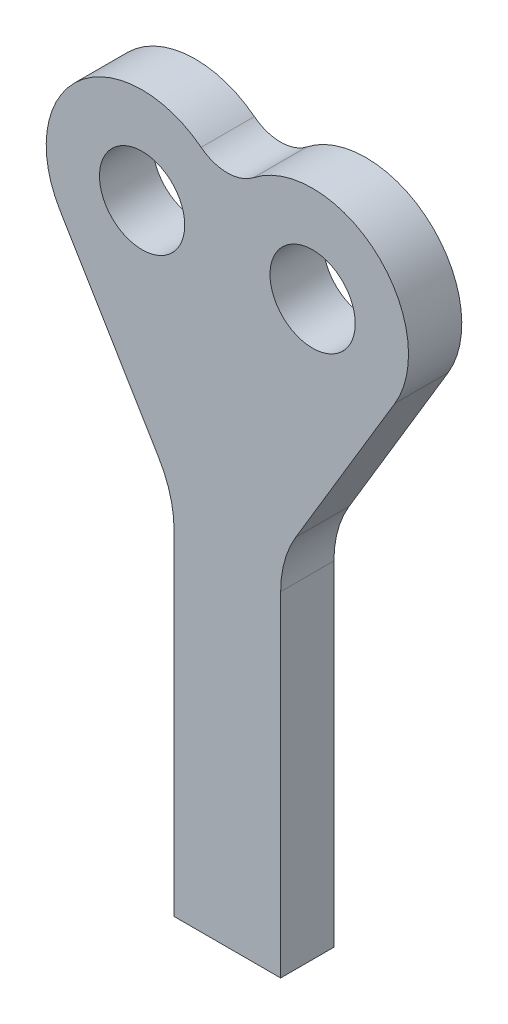
ISO-10303-21;
HEADER;
FILE_DESCRIPTION(('STEP AP214'),'2;1');
FILE_NAME('part.step','',(''),(''),'','','');
FILE_SCHEMA(('AUTOMOTIVE_DESIGN { 1 0 10303 214 1 1 1 1 }'));
ENDSEC;
DATA;
#1=APPLICATION_CONTEXT('core data for automotive mechanical design processes');
#2=APPLICATION_PROTOCOL_DEFINITION('international standard','automotive_design',2000,#1);
#3=PRODUCT_CONTEXT('',#1,'mechanical');
#4=PRODUCT('Part','Part','',(#3));
#5=PRODUCT_RELATED_PRODUCT_CATEGORY('part','',(#4));
#6=PRODUCT_DEFINITION_FORMATION('','',#4);
#7=PRODUCT_DEFINITION_CONTEXT('part definition',#1,'design');
#8=PRODUCT_DEFINITION('design','',#6,#7);
#9=PRODUCT_DEFINITION_SHAPE('','',#8);
#10=(LENGTH_UNIT() NAMED_UNIT(*) SI_UNIT(.MILLI.,.METRE.));
#11=(NAMED_UNIT(*) PLANE_ANGLE_UNIT() SI_UNIT($,.RADIAN.));
#12=(NAMED_UNIT(*) SI_UNIT($,.STERADIAN.) SOLID_ANGLE_UNIT());
#13=UNCERTAINTY_MEASURE_WITH_UNIT(LENGTH_MEASURE(1.E-05),#10,'distance_accuracy_value','');
#14=(GEOMETRIC_REPRESENTATION_CONTEXT(3) GLOBAL_UNCERTAINTY_ASSIGNED_CONTEXT((#13)) GLOBAL_UNIT_ASSIGNED_CONTEXT((#10,
#11,#12)) REPRESENTATION_CONTEXT('',''));
#15=CARTESIAN_POINT('',(0.,0.,0.));
#16=DIRECTION('',(0.,0.,1.));
#17=DIRECTION('',(1.,0.,0.));
#18=AXIS2_PLACEMENT_3D('',#15,#16,#17);
#19=CARTESIAN_POINT('',(-8.64022645073424,-5.17723301954909,3.175));
#20=DIRECTION('',(0.857795120209526,0.513991762331582,0.));
#21=DIRECTION('',(-0.513991762331582,0.857795120209526,0.));
#22=AXIS2_PLACEMENT_3D('',#19,#20,#21);
#23=PLANE('',#22);
#24=DIRECTION('',(0.513991762331582,-0.857795120209526,0.));
#25=VECTOR('',#24,1.);
#26=CARTESIAN_POINT('',(-8.64022645073424,-5.17723301954909,0.));
#27=LINE('',#26,#25);
#28=CARTESIAN_POINT('',(-9.98229911199744,-2.93746292172499,0.));
#29=VERTEX_POINT('',#28);
#30=CARTESIAN_POINT('',(-4.07800098666952,-12.7910802193915,0.));
#31=VERTEX_POINT('',#30);
#32=EDGE_CURVE('E159',#29,#31,#27,.T.);
#33=ORIENTED_EDGE('',*,*,#32,.T.);
#34=DIRECTION('',(0.,0.,-1.));
#35=VECTOR('',#34,1.);
#36=CARTESIAN_POINT('',(-4.07800098666952,-12.7910802193915,3.175));
#37=LINE('',#36,#35);
#38=CARTESIAN_POINT('',(-4.07800098666952,-12.7910802193915,3.175));
#39=VERTEX_POINT('',#38);
#40=EDGE_CURVE('E11',#39,#31,#37,.T.);
#41=ORIENTED_EDGE('',*,*,#40,.F.);
#42=DIRECTION('',(0.513991762331582,-0.857795120209526,0.));
#43=VECTOR('',#42,1.);
#44=CARTESIAN_POINT('',(-8.64022645073424,-5.17723301954909,3.175));
#45=LINE('',#44,#43);
#46=CARTESIAN_POINT('',(-9.98229911199744,-2.93746292172499,3.175));
#47=VERTEX_POINT('',#46);
#48=EDGE_CURVE('E107',#47,#39,#45,.T.);
#49=ORIENTED_EDGE('',*,*,#48,.F.);
#50=DIRECTION('',(0.,0.,-1.));
#51=VECTOR('',#50,1.);
#52=CARTESIAN_POINT('',(-9.98229911199744,-2.93746292172499,3.175));
#53=LINE('',#52,#51);
#54=EDGE_CURVE('E158',#47,#29,#53,.T.);
#55=ORIENTED_EDGE('',*,*,#54,.T.);
#56=EDGE_LOOP('',(#33,#41,#49,#55));
#57=FACE_BOUND('',#56,.T.);
#58=ADVANCED_FACE('F45',(#57),#23,.F.);
#59=CARTESIAN_POINT('',(-9.525,-16.054927910197,3.175));
#60=DIRECTION('',(0.,0.,-1.));
#61=DIRECTION('',(-1.,0.,0.));
#62=AXIS2_PLACEMENT_3D('',#59,#60,#61);
#63=CYLINDRICAL_SURFACE('',#62,6.35);
#64=CARTESIAN_POINT('',(-9.525,-16.054927910197,0.));
#65=DIRECTION('',(0.,0.,1.));
#66=DIRECTION('',(1.,0.,0.));
#67=AXIS2_PLACEMENT_3D('',#64,#65,#66);
#68=CIRCLE('',#67,6.35);
#69=CARTESIAN_POINT('',(-3.175,-16.054927910197,0.));
#70=VERTEX_POINT('',#69);
#71=EDGE_CURVE('E162',#70,#31,#68,.T.);
#72=ORIENTED_EDGE('',*,*,#71,.F.);
#73=DIRECTION('',(0.,0.,-1.));
#74=VECTOR('',#73,1.);
#75=CARTESIAN_POINT('',(-3.175,-16.054927910197,3.175));
#76=LINE('',#75,#74);
#77=CARTESIAN_POINT('',(-3.175,-16.054927910197,3.175));
#78=VERTEX_POINT('',#77);
#79=EDGE_CURVE('E53',#78,#70,#76,.T.);
#80=ORIENTED_EDGE('',*,*,#79,.F.);
#81=CARTESIAN_POINT('',(-9.525,-16.054927910197,3.175));
#82=DIRECTION('',(0.,0.,1.));
#83=DIRECTION('',(1.,0.,0.));
#84=AXIS2_PLACEMENT_3D('',#81,#82,#83);
#85=CIRCLE('',#84,6.35);
#86=EDGE_CURVE('E361',#78,#39,#85,.T.);
#87=ORIENTED_EDGE('',*,*,#86,.T.);
#88=ORIENTED_EDGE('',*,*,#40,.T.);
#89=EDGE_LOOP('',(#72,#80,#87,#88));
#90=FACE_BOUND('',#89,.T.);
#91=ADVANCED_FACE('F208',(#90),#63,.F.);
#92=CARTESIAN_POINT('',(-3.175,0.,3.175));
#93=DIRECTION('',(-1.,0.,0.));
#94=DIRECTION('',(0.,0.,1.));
#95=AXIS2_PLACEMENT_3D('',#92,#93,#94);
#96=PLANE('',#95);
#97=DIRECTION('',(0.,1.,0.));
#98=VECTOR('',#97,1.);
#99=CARTESIAN_POINT('',(-3.175,0.,0.));
#100=LINE('',#99,#98);
#101=CARTESIAN_POINT('',(-3.175,-35.9939115040638,0.));
#102=VERTEX_POINT('',#101);
#103=EDGE_CURVE('E165',#102,#70,#100,.T.);
#104=ORIENTED_EDGE('',*,*,#103,.F.);
#105=DIRECTION('',(0.,0.,-1.));
#106=VECTOR('',#105,1.);
#107=CARTESIAN_POINT('',(-3.175,-35.9939115040638,3.175));
#108=LINE('',#107,#106);
#109=CARTESIAN_POINT('',(-3.175,-35.9939115040638,3.175));
#110=VERTEX_POINT('',#109);
#111=EDGE_CURVE('E198',#110,#102,#108,.T.);
#112=ORIENTED_EDGE('',*,*,#111,.F.);
#113=DIRECTION('',(0.,1.,0.));
#114=VECTOR('',#113,1.);
#115=CARTESIAN_POINT('',(-3.175,0.,3.175));
#116=LINE('',#115,#114);
#117=EDGE_CURVE('E205',#110,#78,#116,.T.);
#118=ORIENTED_EDGE('',*,*,#117,.T.);
#119=ORIENTED_EDGE('',*,*,#79,.T.);
#120=EDGE_LOOP('',(#104,#112,#118,#119));
#121=FACE_BOUND('',#120,.T.);
#122=ADVANCED_FACE('F203',(#121),#96,.T.);
#123=CARTESIAN_POINT('',(0.,-35.9939115040638,3.175));
#124=DIRECTION('',(0.,1.,0.));
#125=DIRECTION('',(0.,0.,1.));
#126=AXIS2_PLACEMENT_3D('',#123,#124,#125);
#127=PLANE('',#126);
#128=DIRECTION('',(1.,0.,0.));
#129=VECTOR('',#128,1.);
#130=CARTESIAN_POINT('',(0.,-35.9939115040638,0.));
#131=LINE('',#130,#129);
#132=CARTESIAN_POINT('',(3.175,-35.9939115040638,0.));
#133=VERTEX_POINT('',#132);
#134=EDGE_CURVE('E168',#102,#133,#131,.T.);
#135=ORIENTED_EDGE('',*,*,#134,.T.);
#136=DIRECTION('',(0.,0.,-1.));
#137=VECTOR('',#136,1.);
#138=CARTESIAN_POINT('',(3.175,-35.9939115040638,3.175));
#139=LINE('',#138,#137);
#140=CARTESIAN_POINT('',(3.175,-35.9939115040638,3.175));
#141=VERTEX_POINT('',#140);
#142=EDGE_CURVE('E195',#141,#133,#139,.T.);
#143=ORIENTED_EDGE('',*,*,#142,.F.);
#144=DIRECTION('',(1.,0.,0.));
#145=VECTOR('',#144,1.);
#146=CARTESIAN_POINT('',(0.,-35.9939115040638,3.175));
#147=LINE('',#146,#145);
#148=EDGE_CURVE('E226',#110,#141,#147,.T.);
#149=ORIENTED_EDGE('',*,*,#148,.F.);
#150=ORIENTED_EDGE('',*,*,#111,.T.);
#151=EDGE_LOOP('',(#135,#143,#149,#150));
#152=FACE_BOUND('',#151,.T.);
#153=ADVANCED_FACE('F217',(#152),#127,.F.);
#154=CARTESIAN_POINT('',(3.175,0.,3.175));
#155=DIRECTION('',(-1.,0.,0.));
#156=DIRECTION('',(0.,0.,1.));
#157=AXIS2_PLACEMENT_3D('',#154,#155,#156);
#158=PLANE('',#157);
#159=DIRECTION('',(0.,1.,0.));
#160=VECTOR('',#159,1.);
#161=CARTESIAN_POINT('',(3.175,0.,0.));
#162=LINE('',#161,#160);
#163=CARTESIAN_POINT('',(3.175,-16.054927910197,0.));
#164=VERTEX_POINT('',#163);
#165=EDGE_CURVE('E170',#133,#164,#162,.T.);
#166=ORIENTED_EDGE('',*,*,#165,.T.);
#167=DIRECTION('',(0.,0.,-1.));
#168=VECTOR('',#167,1.);
#169=CARTESIAN_POINT('',(3.175,-16.054927910197,3.175));
#170=LINE('',#169,#168);
#171=CARTESIAN_POINT('',(3.175,-16.054927910197,3.175));
#172=VERTEX_POINT('',#171);
#173=EDGE_CURVE('E193',#172,#164,#170,.T.);
#174=ORIENTED_EDGE('',*,*,#173,.F.);
#175=DIRECTION('',(0.,1.,0.));
#176=VECTOR('',#175,1.);
#177=CARTESIAN_POINT('',(3.175,0.,3.175));
#178=LINE('',#177,#176);
#179=EDGE_CURVE('E223',#141,#172,#178,.T.);
#180=ORIENTED_EDGE('',*,*,#179,.F.);
#181=ORIENTED_EDGE('',*,*,#142,.T.);
#182=EDGE_LOOP('',(#166,#174,#180,#181));
#183=FACE_BOUND('',#182,.T.);
#184=ADVANCED_FACE('F221',(#183),#158,.F.);
#185=CARTESIAN_POINT('',(9.525,-16.054927910197,3.175));
#186=DIRECTION('',(0.,0.,-1.));
#187=DIRECTION('',(-1.,0.,0.));
#188=AXIS2_PLACEMENT_3D('',#185,#186,#187);
#189=CYLINDRICAL_SURFACE('',#188,6.35);
#190=CARTESIAN_POINT('',(9.525,-16.054927910197,0.));
#191=DIRECTION('',(0.,0.,1.));
#192=DIRECTION('',(1.,0.,0.));
#193=AXIS2_PLACEMENT_3D('',#190,#191,#192);
#194=CIRCLE('',#193,6.35);
#195=CARTESIAN_POINT('',(4.07800098666953,-12.7910802193915,0.));
#196=VERTEX_POINT('',#195);
#197=EDGE_CURVE('E173',#196,#164,#194,.T.);
#198=ORIENTED_EDGE('',*,*,#197,.F.);
#199=DIRECTION('',(0.,0.,-1.));
#200=VECTOR('',#199,1.);
#201=CARTESIAN_POINT('',(4.07800098666953,-12.7910802193915,3.175));
#202=LINE('',#201,#200);
#203=CARTESIAN_POINT('',(4.07800098666953,-12.7910802193915,3.175));
#204=VERTEX_POINT('',#203);
#205=EDGE_CURVE('E191',#204,#196,#202,.T.);
#206=ORIENTED_EDGE('',*,*,#205,.F.);
#207=CARTESIAN_POINT('',(9.525,-16.054927910197,3.175));
#208=DIRECTION('',(0.,0.,1.));
#209=DIRECTION('',(1.,0.,0.));
#210=AXIS2_PLACEMENT_3D('',#207,#208,#209);
#211=CIRCLE('',#210,6.35);
#212=EDGE_CURVE('E225',#204,#172,#211,.T.);
#213=ORIENTED_EDGE('',*,*,#212,.T.);
#214=ORIENTED_EDGE('',*,*,#173,.T.);
#215=EDGE_LOOP('',(#198,#206,#213,#214));
#216=FACE_BOUND('',#215,.T.);
#217=ADVANCED_FACE('F263',(#216),#189,.F.);
#218=CARTESIAN_POINT('',(8.64022645073424,-5.17723301954908,3.175));
#219=DIRECTION('',(0.857795120209526,-0.513991762331581,0.));
#220=DIRECTION('',(0.513991762331581,0.857795120209526,0.));
#221=AXIS2_PLACEMENT_3D('',#218,#219,#220);
#222=PLANE('',#221);
#223=DIRECTION('',(-0.513991762331581,-0.857795120209526,0.));
#224=VECTOR('',#223,1.);
#225=CARTESIAN_POINT('',(8.64022645073424,-5.17723301954908,0.));
#226=LINE('',#225,#224);
#227=CARTESIAN_POINT('',(9.98229911199744,-2.93746292172498,0.));
#228=VERTEX_POINT('',#227);
#229=EDGE_CURVE('E176',#228,#196,#226,.T.);
#230=ORIENTED_EDGE('',*,*,#229,.F.);
#231=DIRECTION('',(0.,0.,-1.));
#232=VECTOR('',#231,1.);
#233=CARTESIAN_POINT('',(9.98229911199744,-2.93746292172498,3.175));
#234=LINE('',#233,#232);
#235=CARTESIAN_POINT('',(9.98229911199744,-2.93746292172498,3.175));
#236=VERTEX_POINT('',#235);
#237=EDGE_CURVE('E144',#236,#228,#234,.T.);
#238=ORIENTED_EDGE('',*,*,#237,.F.);
#239=DIRECTION('',(-0.513991762331581,-0.857795120209526,0.));
#240=VECTOR('',#239,1.);
#241=CARTESIAN_POINT('',(8.64022645073424,-5.17723301954908,3.175));
#242=LINE('',#241,#240);
#243=EDGE_CURVE('E137',#236,#204,#242,.T.);
#244=ORIENTED_EDGE('',*,*,#243,.T.);
#245=ORIENTED_EDGE('',*,*,#205,.T.);
#246=EDGE_LOOP('',(#230,#238,#244,#245));
#247=FACE_BOUND('',#246,.T.);
#248=ADVANCED_FACE('F233',(#247),#222,.T.);
#249=CARTESIAN_POINT('',(5.08,0.,3.175));
#250=DIRECTION('',(0.,0.,-1.));
#251=DIRECTION('',(-1.,0.,0.));
#252=AXIS2_PLACEMENT_3D('',#249,#250,#251);
#253=CYLINDRICAL_SURFACE('',#252,5.715);
#254=CARTESIAN_POINT('',(5.08,0.,0.));
#255=DIRECTION('',(0.,0.,1.));
#256=DIRECTION('',(1.,0.,0.));
#257=AXIS2_PLACEMENT_3D('',#254,#255,#256);
#258=CIRCLE('',#257,5.715);
#259=CARTESIAN_POINT('',(1.56307692307692,4.50471720211224,0.));
#260=VERTEX_POINT('',#259);
#261=EDGE_CURVE('E143',#228,#260,#258,.T.);
#262=ORIENTED_EDGE('',*,*,#261,.T.);
#263=DIRECTION('',(0.,0.,-1.));
#264=VECTOR('',#263,1.);
#265=CARTESIAN_POINT('',(1.56307692307692,4.50471720211224,3.175));
#266=LINE('',#265,#264);
#267=CARTESIAN_POINT('',(1.56307692307692,4.50471720211224,3.175));
#268=VERTEX_POINT('',#267);
#269=EDGE_CURVE('E140',#268,#260,#266,.T.);
#270=ORIENTED_EDGE('',*,*,#269,.F.);
#271=CARTESIAN_POINT('',(5.08,0.,3.175));
#272=DIRECTION('',(0.,0.,1.));
#273=DIRECTION('',(1.,0.,0.));
#274=AXIS2_PLACEMENT_3D('',#271,#272,#273);
#275=CIRCLE('',#274,5.715);
#276=EDGE_CURVE('E129',#236,#268,#275,.T.);
#277=ORIENTED_EDGE('',*,*,#276,.F.);
#278=ORIENTED_EDGE('',*,*,#237,.T.);
#279=EDGE_LOOP('',(#262,#270,#277,#278));
#280=FACE_BOUND('',#279,.T.);
#281=ADVANCED_FACE('F141',(#280),#253,.T.);
#282=CARTESIAN_POINT('',(0.,6.50681373638435,3.175));
#283=DIRECTION('',(0.,0.,-1.));
#284=DIRECTION('',(-1.,0.,0.));
#285=AXIS2_PLACEMENT_3D('',#282,#283,#284);
#286=CYLINDRICAL_SURFACE('',#285,2.54);
#287=CARTESIAN_POINT('',(0.,6.50681373638435,0.));
#288=DIRECTION('',(0.,0.,1.));
#289=DIRECTION('',(1.,0.,0.));
#290=AXIS2_PLACEMENT_3D('',#287,#288,#289);
#291=CIRCLE('',#290,2.54);
#292=CARTESIAN_POINT('',(-1.56307692307692,4.50471720211224,0.));
#293=VERTEX_POINT('',#292);
#294=EDGE_CURVE('E95',#260,#293,#291,.F.);
#295=ORIENTED_EDGE('',*,*,#294,.T.);
#296=DIRECTION('',(0.,0.,-1.));
#297=VECTOR('',#296,1.);
#298=CARTESIAN_POINT('',(-1.56307692307692,4.50471720211224,3.175));
#299=LINE('',#298,#297);
#300=CARTESIAN_POINT('',(-1.56307692307692,4.50471720211224,3.175));
#301=VERTEX_POINT('',#300);
#302=EDGE_CURVE('E145',#301,#293,#299,.T.);
#303=ORIENTED_EDGE('',*,*,#302,.F.);
#304=CARTESIAN_POINT('',(0.,6.50681373638435,3.175));
#305=DIRECTION('',(0.,0.,1.));
#306=DIRECTION('',(1.,0.,0.));
#307=AXIS2_PLACEMENT_3D('',#304,#305,#306);
#308=CIRCLE('',#307,2.54);
#309=EDGE_CURVE('E134',#268,#301,#308,.F.);
#310=ORIENTED_EDGE('',*,*,#309,.F.);
#311=ORIENTED_EDGE('',*,*,#269,.T.);
#312=EDGE_LOOP('',(#295,#303,#310,#311));
#313=FACE_BOUND('',#312,.T.);
#314=ADVANCED_FACE('F147',(#313),#286,.F.);
#315=CARTESIAN_POINT('',(-5.08,0.,3.175));
#316=DIRECTION('',(0.,0.,-1.));
#317=DIRECTION('',(-1.,0.,0.));
#318=AXIS2_PLACEMENT_3D('',#315,#316,#317);
#319=CYLINDRICAL_SURFACE('',#318,2.54);
#320=CARTESIAN_POINT('',(-5.08,0.,3.175));
#321=DIRECTION('',(0.,0.,1.));
#322=DIRECTION('',(1.,0.,0.));
#323=AXIS2_PLACEMENT_3D('',#320,#321,#322);
#324=CIRCLE('',#323,2.54);
#325=CARTESIAN_POINT('',(-2.54,0.,3.175));
#326=VERTEX_POINT('',#325);
#327=EDGE_CURVE('E149',#326,#326,#324,.T.);
#328=ORIENTED_EDGE('',*,*,#327,.T.);
#329=EDGE_LOOP('',(#328));
#330=FACE_BOUND('',#329,.T.);
#331=CARTESIAN_POINT('',(-5.08,0.,0.));
#332=DIRECTION('',(0.,0.,1.));
#333=DIRECTION('',(1.,0.,0.));
#334=AXIS2_PLACEMENT_3D('',#331,#332,#333);
#335=CIRCLE('',#334,2.54);
#336=CARTESIAN_POINT('',(-2.54,0.,0.));
#337=VERTEX_POINT('',#336);
#338=EDGE_CURVE('E182',#337,#337,#335,.T.);
#339=ORIENTED_EDGE('',*,*,#338,.F.);
#340=EDGE_LOOP('',(#339));
#341=FACE_BOUND('',#340,.T.);
#342=ADVANCED_FACE('F239',(#330,#341),#319,.F.);
#343=CARTESIAN_POINT('',(-5.08,0.,3.175));
#344=DIRECTION('',(0.,0.,-1.));
#345=DIRECTION('',(-1.,0.,0.));
#346=AXIS2_PLACEMENT_3D('',#343,#344,#345);
#347=CYLINDRICAL_SURFACE('',#346,5.715);
#348=CARTESIAN_POINT('',(-5.08,0.,0.));
#349=DIRECTION('',(0.,0.,1.));
#350=DIRECTION('',(1.,0.,0.));
#351=AXIS2_PLACEMENT_3D('',#348,#349,#350);
#352=CIRCLE('',#351,5.715);
#353=EDGE_CURVE('E101',#293,#29,#352,.T.);
#354=ORIENTED_EDGE('',*,*,#353,.T.);
#355=ORIENTED_EDGE('',*,*,#54,.F.);
#356=CARTESIAN_POINT('',(-5.08,0.,3.175));
#357=DIRECTION('',(0.,0.,1.));
#358=DIRECTION('',(1.,0.,0.));
#359=AXIS2_PLACEMENT_3D('',#356,#357,#358);
#360=CIRCLE('',#359,5.715);
#361=EDGE_CURVE('E61',#301,#47,#360,.T.);
#362=ORIENTED_EDGE('',*,*,#361,.F.);
#363=ORIENTED_EDGE('',*,*,#302,.T.);
#364=EDGE_LOOP('',(#354,#355,#362,#363));
#365=FACE_BOUND('',#364,.T.);
#366=ADVANCED_FACE('F236',(#365),#347,.T.);
#367=CARTESIAN_POINT('',(5.08,0.,3.175));
#368=DIRECTION('',(0.,0.,-1.));
#369=DIRECTION('',(-1.,0.,0.));
#370=AXIS2_PLACEMENT_3D('',#367,#368,#369);
#371=CYLINDRICAL_SURFACE('',#370,2.54);
#372=CARTESIAN_POINT('',(5.08,0.,3.175));
#373=DIRECTION('',(0.,0.,1.));
#374=DIRECTION('',(1.,0.,0.));
#375=AXIS2_PLACEMENT_3D('',#372,#373,#374);
#376=CIRCLE('',#375,2.54);
#377=CARTESIAN_POINT('',(7.62,0.,3.175));
#378=VERTEX_POINT('',#377);
#379=EDGE_CURVE('E155',#378,#378,#376,.T.);
#380=ORIENTED_EDGE('',*,*,#379,.T.);
#381=EDGE_LOOP('',(#380));
#382=FACE_BOUND('',#381,.T.);
#383=CARTESIAN_POINT('',(5.08,0.,0.));
#384=DIRECTION('',(0.,0.,1.));
#385=DIRECTION('',(1.,0.,0.));
#386=AXIS2_PLACEMENT_3D('',#383,#384,#385);
#387=CIRCLE('',#386,2.54);
#388=CARTESIAN_POINT('',(7.62,0.,0.));
#389=VERTEX_POINT('',#388);
#390=EDGE_CURVE('E185',#389,#389,#387,.T.);
#391=ORIENTED_EDGE('',*,*,#390,.F.);
#392=EDGE_LOOP('',(#391));
#393=FACE_BOUND('',#392,.T.);
#394=ADVANCED_FACE('F238',(#382,#393),#371,.F.);
#395=CARTESIAN_POINT('',(0.,0.,3.175));
#396=DIRECTION('',(0.,0.,1.));
#397=DIRECTION('',(1.,0.,0.));
#398=AXIS2_PLACEMENT_3D('',#395,#396,#397);
#399=PLANE('',#398);
#400=ORIENTED_EDGE('',*,*,#48,.T.);
#401=ORIENTED_EDGE('',*,*,#86,.F.);
#402=ORIENTED_EDGE('',*,*,#117,.F.);
#403=ORIENTED_EDGE('',*,*,#148,.T.);
#404=ORIENTED_EDGE('',*,*,#179,.T.);
#405=ORIENTED_EDGE('',*,*,#212,.F.);
#406=ORIENTED_EDGE('',*,*,#243,.F.);
#407=ORIENTED_EDGE('',*,*,#276,.T.);
#408=ORIENTED_EDGE('',*,*,#309,.T.);
#409=ORIENTED_EDGE('',*,*,#361,.T.);
#410=EDGE_LOOP('',(#400,#401,#402,#403,#404,#405,#406,#407,#408,#409));
#411=FACE_BOUND('',#410,.T.);
#412=ORIENTED_EDGE('',*,*,#327,.F.);
#413=EDGE_LOOP('',(#412));
#414=FACE_BOUND('',#413,.T.);
#415=ORIENTED_EDGE('',*,*,#379,.F.);
#416=EDGE_LOOP('',(#415));
#417=FACE_BOUND('',#416,.T.);
#418=ADVANCED_FACE('F131',(#411,#414,#417),#399,.T.);
#419=CARTESIAN_POINT('',(0.,0.,0.));
#420=DIRECTION('',(0.,0.,1.));
#421=DIRECTION('',(1.,0.,0.));
#422=AXIS2_PLACEMENT_3D('',#419,#420,#421);
#423=PLANE('',#422);
#424=ORIENTED_EDGE('',*,*,#32,.F.);
#425=ORIENTED_EDGE('',*,*,#353,.F.);
#426=ORIENTED_EDGE('',*,*,#294,.F.);
#427=ORIENTED_EDGE('',*,*,#261,.F.);
#428=ORIENTED_EDGE('',*,*,#229,.T.);
#429=ORIENTED_EDGE('',*,*,#197,.T.);
#430=ORIENTED_EDGE('',*,*,#165,.F.);
#431=ORIENTED_EDGE('',*,*,#134,.F.);
#432=ORIENTED_EDGE('',*,*,#103,.T.);
#433=ORIENTED_EDGE('',*,*,#71,.T.);
#434=EDGE_LOOP('',(#424,#425,#426,#427,#428,#429,#430,#431,#432,#433));
#435=FACE_BOUND('',#434,.T.);
#436=ORIENTED_EDGE('',*,*,#338,.T.);
#437=EDGE_LOOP('',(#436));
#438=FACE_BOUND('',#437,.T.);
#439=ORIENTED_EDGE('',*,*,#390,.T.);
#440=EDGE_LOOP('',(#439));
#441=FACE_BOUND('',#440,.T.);
#442=ADVANCED_FACE('F212',(#435,#438,#441),#423,.F.);
#443=CLOSED_SHELL('',(#58,#91,#122,#153,#184,#217,#248,#281,#314,#342,#366,#394,#418,#442));
#444=MANIFOLD_SOLID_BREP('B2',#443);
#445=ADVANCED_BREP_SHAPE_REPRESENTATION('',(#18,#444),#14);
#446=SHAPE_DEFINITION_REPRESENTATION(#9,#445);
ENDSEC;
END-ISO-10303-21;
